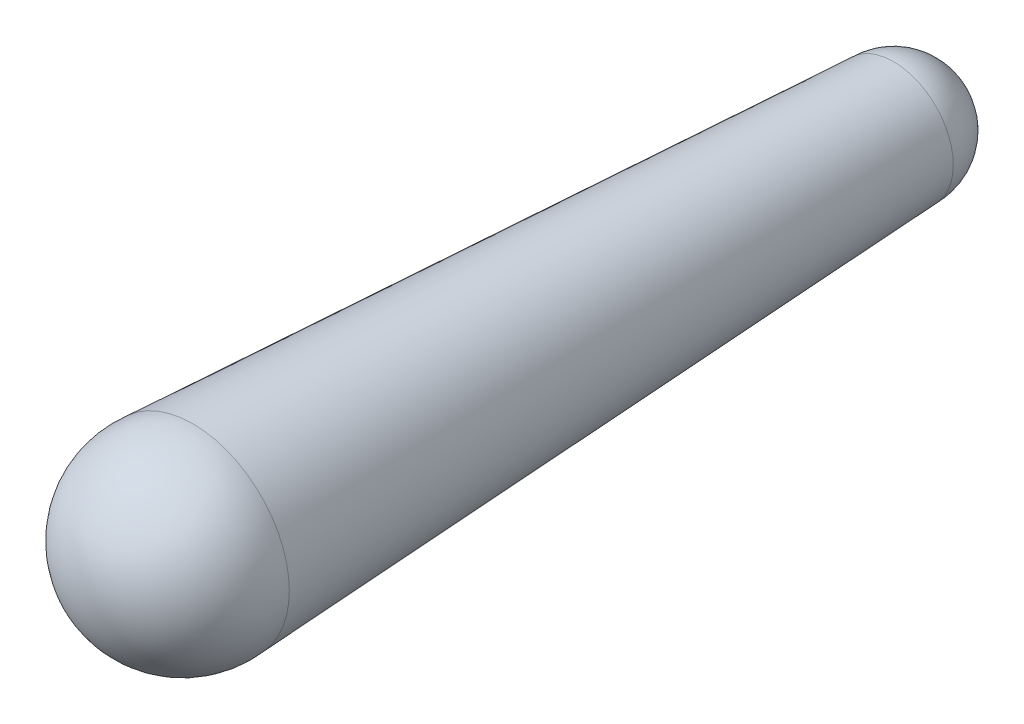
ISO-10303-21;
HEADER;
FILE_DESCRIPTION(('STEP AP214'),'2;1');
FILE_NAME('part.step','',(''),(''),'','','');
FILE_SCHEMA(('AUTOMOTIVE_DESIGN { 1 0 10303 214 1 1 1 1 }'));
ENDSEC;
DATA;
#1=APPLICATION_CONTEXT('core data for automotive mechanical design processes');
#2=APPLICATION_PROTOCOL_DEFINITION('international standard','automotive_design',2000,#1);
#3=PRODUCT_CONTEXT('',#1,'mechanical');
#4=PRODUCT('Part','Part','',(#3));
#5=PRODUCT_RELATED_PRODUCT_CATEGORY('part','',(#4));
#6=PRODUCT_DEFINITION_FORMATION('','',#4);
#7=PRODUCT_DEFINITION_CONTEXT('part definition',#1,'design');
#8=PRODUCT_DEFINITION('design','',#6,#7);
#9=PRODUCT_DEFINITION_SHAPE('','',#8);
#10=(LENGTH_UNIT() NAMED_UNIT(*) SI_UNIT(.MILLI.,.METRE.));
#11=(NAMED_UNIT(*) PLANE_ANGLE_UNIT() SI_UNIT($,.RADIAN.));
#12=(NAMED_UNIT(*) SI_UNIT($,.STERADIAN.) SOLID_ANGLE_UNIT());
#13=UNCERTAINTY_MEASURE_WITH_UNIT(LENGTH_MEASURE(1.E-05),#10,'distance_accuracy_value','');
#14=(GEOMETRIC_REPRESENTATION_CONTEXT(3) GLOBAL_UNCERTAINTY_ASSIGNED_CONTEXT((#13)) GLOBAL_UNIT_ASSIGNED_CONTEXT((#10,
#11,#12)) REPRESENTATION_CONTEXT('',''));
#15=CARTESIAN_POINT('',(0.,0.,0.));
#16=DIRECTION('',(0.,0.,1.));
#17=DIRECTION('',(1.,0.,0.));
#18=AXIS2_PLACEMENT_3D('',#15,#16,#17);
#19=CARTESIAN_POINT('',(0.,0.,0.));
#20=DIRECTION('',(0.,0.,1.));
#21=DIRECTION('',(1.,0.,0.));
#22=AXIS2_PLACEMENT_3D('',#19,#20,#21);
#23=CONICAL_SURFACE('',#22,57.15,0.05235987755983);
#24=CARTESIAN_POINT('',(0.,0.,-5.97380167574627));
#25=DIRECTION('',(0.,0.,1.));
#26=DIRECTION('',(1.,0.,0.));
#27=AXIS2_PLACEMENT_3D('',#24,#25,#26);
#28=CIRCLE('',#27,56.8369263202968);
#29=CARTESIAN_POINT('',(56.8369263202968,0.,-5.97380167574627));
#30=VERTEX_POINT('',#29);
#31=EDGE_CURVE('E10',#30,#30,#28,.T.);
#32=ORIENTED_EDGE('',*,*,#31,.F.);
#33=EDGE_LOOP('',(#32));
#34=FACE_BOUND('',#33,.T.);
#35=CARTESIAN_POINT('',(0.,0.,-419.1));
#36=DIRECTION('',(0.,0.,1.));
#37=DIRECTION('',(1.,0.,0.));
#38=AXIS2_PLACEMENT_3D('',#35,#36,#37);
#39=CIRCLE('',#38,35.1858997024774);
#40=CARTESIAN_POINT('',(35.1858997024774,0.,-419.1));
#41=VERTEX_POINT('',#40);
#42=EDGE_CURVE('E33',#41,#41,#39,.F.);
#43=ORIENTED_EDGE('',*,*,#42,.F.);
#44=EDGE_LOOP('',(#43));
#45=FACE_BOUND('',#44,.T.);
#46=ADVANCED_FACE('F30',(#34,#45),#23,.T.);
#47=CARTESIAN_POINT('',(0.,0.,-419.1));
#48=DIRECTION('',(0.,1.,0.));
#49=DIRECTION('',(0.,0.,-1.));
#50=AXIS2_PLACEMENT_3D('',#47,#48,#49);
#51=SPHERICAL_SURFACE('',#50,35.1858997024774);
#52=CARTESIAN_POINT('',(0.,0.,-419.1));
#53=DIRECTION('',(0.,0.,1.));
#54=DIRECTION('',(1.,0.,0.));
#55=AXIS2_PLACEMENT_3D('',#52,#53,#54);
#56=SPHERICAL_SURFACE('',#55,35.1858997024774);
#57=ORIENTED_EDGE('',*,*,#42,.T.);
#58=EDGE_LOOP('',(#57));
#59=FACE_BOUND('',#58,.T.);
#60=ADVANCED_FACE('F42',(#59),#56,.T.);
#61=CARTESIAN_POINT('',(0.,0.,0.));
#62=DIRECTION('',(0.,1.,0.));
#63=DIRECTION('',(0.,0.,-1.));
#64=AXIS2_PLACEMENT_3D('',#61,#62,#63);
#65=SPHERICAL_SURFACE('',#64,57.15);
#66=CARTESIAN_POINT('',(0.,0.,0.));
#67=DIRECTION('',(0.,0.,1.));
#68=DIRECTION('',(1.,0.,0.));
#69=AXIS2_PLACEMENT_3D('',#66,#67,#68);
#70=SPHERICAL_SURFACE('',#69,57.15);
#71=ORIENTED_EDGE('',*,*,#31,.T.);
#72=EDGE_LOOP('',(#71));
#73=FACE_BOUND('',#72,.T.);
#74=ADVANCED_FACE('F49',(#73),#70,.T.);
#75=CLOSED_SHELL('',(#46,#60,#74));
#76=MANIFOLD_SOLID_BREP('B2',#75);
#77=ADVANCED_BREP_SHAPE_REPRESENTATION('',(#18,#76),#14);
#78=SHAPE_DEFINITION_REPRESENTATION(#9,#77);
ENDSEC;
END-ISO-10303-21;
